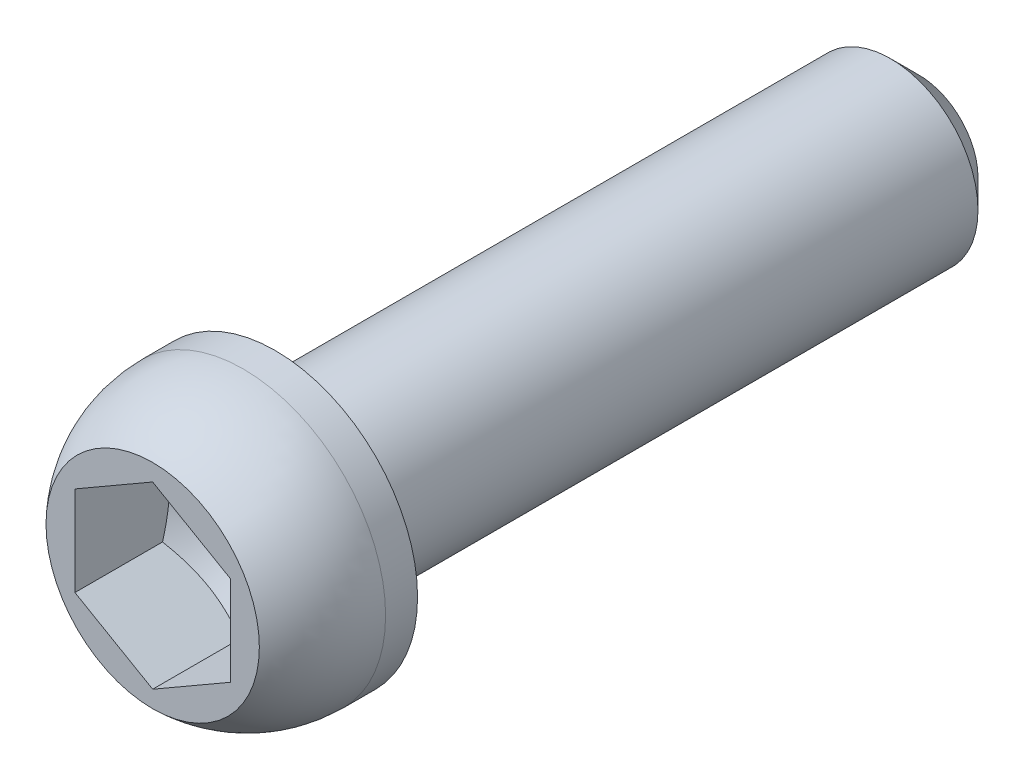
ISO-10303-21;
HEADER;
FILE_DESCRIPTION(('STEP AP214'),'2;1');
FILE_NAME('part.step','',(''),(''),'','','');
FILE_SCHEMA(('AUTOMOTIVE_DESIGN { 1 0 10303 214 1 1 1 1 }'));
ENDSEC;
DATA;
#1=APPLICATION_CONTEXT('core data for automotive mechanical design processes');
#2=APPLICATION_PROTOCOL_DEFINITION('international standard','automotive_design',2000,#1);
#3=PRODUCT_CONTEXT('',#1,'mechanical');
#4=PRODUCT('Part','Part','',(#3));
#5=PRODUCT_RELATED_PRODUCT_CATEGORY('part','',(#4));
#6=PRODUCT_DEFINITION_FORMATION('','',#4);
#7=PRODUCT_DEFINITION_CONTEXT('part definition',#1,'design');
#8=PRODUCT_DEFINITION('design','',#6,#7);
#9=PRODUCT_DEFINITION_SHAPE('','',#8);
#10=(LENGTH_UNIT() NAMED_UNIT(*) SI_UNIT(.MILLI.,.METRE.));
#11=(NAMED_UNIT(*) PLANE_ANGLE_UNIT() SI_UNIT($,.RADIAN.));
#12=(NAMED_UNIT(*) SI_UNIT($,.STERADIAN.) SOLID_ANGLE_UNIT());
#13=UNCERTAINTY_MEASURE_WITH_UNIT(LENGTH_MEASURE(1.E-05),#10,'distance_accuracy_value','');
#14=(GEOMETRIC_REPRESENTATION_CONTEXT(3) GLOBAL_UNCERTAINTY_ASSIGNED_CONTEXT((#13)) GLOBAL_UNIT_ASSIGNED_CONTEXT((#10,
#11,#12)) REPRESENTATION_CONTEXT('',''));
#15=CARTESIAN_POINT('',(0.,0.,0.));
#16=DIRECTION('',(0.,0.,1.));
#17=DIRECTION('',(1.,0.,0.));
#18=AXIS2_PLACEMENT_3D('',#15,#16,#17);
#19=CARTESIAN_POINT('',(0.,0.,-3.18333333333335));
#20=DIRECTION('',(0.,0.,1.));
#21=DIRECTION('',(1.,0.,0.));
#22=AXIS2_PLACEMENT_3D('',#19,#20,#21);
#23=CONICAL_SURFACE('',#22,0.,1.04719755119659);
#24=CARTESIAN_POINT('',(0.,0.,-3.18333333333335));
#25=VERTEX_POINT('',#24);
#26=VERTEX_LOOP('',#25);
#27=FACE_BOUND('',#26,.T.);
#28=CARTESIAN_POINT('',(1.775,-2.65388259149938,-1.33999236202937));
#29=CARTESIAN_POINT('',(1.775,-2.57723187339807,-1.37676648880287));
#30=CARTESIAN_POINT('',(1.775,-2.50039458134704,-1.41315855616911));
#31=CARTESIAN_POINT('',(1.775,-2.34624701162899,-1.4849620790204));
#32=CARTESIAN_POINT('',(1.775,-2.2689366518576,-1.52037335802871));
#33=CARTESIAN_POINT('',(1.775,-2.11329983278051,-1.59019663756769));
#34=CARTESIAN_POINT('',(1.775,-2.03497005455177,-1.62460127341837));
#35=CARTESIAN_POINT('',(1.775,-1.87765447943204,-1.69186699839932));
#36=CARTESIAN_POINT('',(1.775,-1.79866871690305,-1.72472816778732));
#37=CARTESIAN_POINT('',(1.775,-1.63782918302726,-1.78933644797688));
#38=CARTESIAN_POINT('',(1.775,-1.55595441399543,-1.82103198073615));
#39=CARTESIAN_POINT('',(1.775,-1.39123234048797,-1.88177722179619));
#40=CARTESIAN_POINT('',(1.775,-1.30838491561127,-1.91082659855747));
#41=CARTESIAN_POINT('',(1.775,-1.05851844665112,-1.99278038208063));
#42=CARTESIAN_POINT('',(1.775,-0.889717952953571,-2.04068269455351));
#43=CARTESIAN_POINT('',(1.775,-0.633139778883583,-2.09624702229421));
#44=CARTESIAN_POINT('',(1.775,-0.547132674269155,-2.11204643392357));
#45=CARTESIAN_POINT('',(1.775,-0.374150960599354,-2.13713244979764));
#46=CARTESIAN_POINT('',(1.775,-0.287176417328946,-2.14641949416034));
#47=CARTESIAN_POINT('',(1.775,-0.113788074254875,-2.15762173093196));
#48=CARTESIAN_POINT('',(1.775,-0.0273800417458598,-2.15962391641767));
#49=CARTESIAN_POINT('',(1.775,0.145293310861215,-2.15631901318237));
#50=CARTESIAN_POINT('',(1.775,0.231558621791361,-2.15101147186985));
#51=CARTESIAN_POINT('',(1.775,0.44440547183115,-2.12936480003112));
#52=CARTESIAN_POINT('',(1.775,0.570574541219666,-2.10896902686087));
#53=CARTESIAN_POINT('',(1.775,0.82045917206924,-2.05637421276262));
#54=CARTESIAN_POINT('',(1.775,0.944171586239336,-2.024160946065));
#55=CARTESIAN_POINT('',(1.775,1.12919710426535,-1.96913281473636));
#56=CARTESIAN_POINT('',(1.775,1.19146662732273,-1.94941541683593));
#57=CARTESIAN_POINT('',(1.775,1.31535748816402,-1.9081566488224));
#58=CARTESIAN_POINT('',(1.775,1.37697920384234,-1.88661641700883));
#59=CARTESIAN_POINT('',(1.775,1.49965679859283,-1.84202480868852));
#60=CARTESIAN_POINT('',(1.775,1.56071277820737,-1.81897370680913));
#61=CARTESIAN_POINT('',(1.775,1.68234363712417,-1.77160969301198));
#62=CARTESIAN_POINT('',(1.775,1.74291843313647,-1.74729656790644));
#63=CARTESIAN_POINT('',(1.775,1.89753807445394,-1.68367887381013));
#64=CARTESIAN_POINT('',(1.775,1.99127375112719,-1.64362368908069));
#65=CARTESIAN_POINT('',(1.775,2.17789863824487,-1.56158242825227));
#66=CARTESIAN_POINT('',(1.775,2.2707877846506,-1.51959620750253));
#67=CARTESIAN_POINT('',(1.775,2.54846748992191,-1.39142170306099));
#68=CARTESIAN_POINT('',(1.775,2.73223929797471,-1.30303071757429));
#69=CARTESIAN_POINT('',(1.775,3.09821289129684,-1.12254164384944));
#70=CARTESIAN_POINT('',(1.775,3.28041246874527,-1.03043913190653));
#71=CARTESIAN_POINT('',(1.775,3.64356329519938,-0.843865855290622));
#72=CARTESIAN_POINT('',(1.775,3.82451469918764,-0.749395391644858));
#73=CARTESIAN_POINT('',(1.775,4.16851495546281,-0.567816839144511));
#74=CARTESIAN_POINT('',(1.775,4.33164151455477,-0.480855454900836));
#75=CARTESIAN_POINT('',(1.775,4.65736990281899,-0.305941850642));
#76=CARTESIAN_POINT('',(1.775,4.81997171228405,-0.217989593958666));
#77=CARTESIAN_POINT('',(1.775,5.14435798457942,-0.0415673817268955));
#78=CARTESIAN_POINT('',(1.775,5.30614347439577,0.0469006880320478));
#79=CARTESIAN_POINT('',(1.775,5.62938736266175,0.224412626209064));
#80=CARTESIAN_POINT('',(1.775,5.79084577778576,0.313456464251978));
#81=CARTESIAN_POINT('',(1.775,5.9521866823928,0.402711437815645));
#82=B_SPLINE_CURVE_WITH_KNOTS('',3,(#28,#29,#30,#31,#32,#33,#34,#35,#36,#37,#38,#39,#40,#41,#42,
#43,#44,#45,#46,#47,#48,#49,#50,#51,#52,#53,#54,#55,#56,#57,#58,#59,#60,#61,#62,#63,#64,#65,#66,
#67,#68,#69,#70,#71,#72,#73,#74,#75,#76,#77,#78,#79,#80,#81),.UNSPECIFIED.,.F.,.F.,(4,2,2,2,2,2,
2,2,2,2,2,2,2,2,2,2,2,2,2,2,2,2,2,2,2,2,4),(0.,0.255050355099275,0.510146308038466,
0.766789682079517,1.02341969627536,1.28675824802195,1.55012974846392,2.07538700855926,
2.33752667378969,2.59964862142218,2.85862993855996,3.11762729159286,3.50026163136395,
3.88335810177898,4.0792865786266,4.27509359493504,4.47086511803289,4.66666982022703,
4.97244403467842,5.27824119160158,5.88993650764241,6.50238380490785,7.11475363542393,
7.66932438016952,8.22391571518533,8.77709643289933,9.33024820138869),.UNSPECIFIED.);
#83=CARTESIAN_POINT('',(1.775,1.02479672781159,-2.));
#84=VERTEX_POINT('',#83);
#85=CARTESIAN_POINT('',(1.775,-1.02479672781159,-2.));
#86=VERTEX_POINT('',#85);
#87=EDGE_CURVE('E72',#84,#86,#82,.F.);
#88=ORIENTED_EDGE('',*,*,#87,.F.);
#89=CARTESIAN_POINT('',(-0.000200000000000006,2.04970892567701,-1.99993332769985));
#90=CARTESIAN_POINT('',(0.0778038755846786,2.00467336711036,-2.02594650703797));
#91=CARTESIAN_POINT('',(0.156481072053006,1.95924906655029,-2.04960496849523));
#92=CARTESIAN_POINT('',(0.315197983124454,1.86761381521824,-2.09090202184949));
#93=CARTESIAN_POINT('',(0.395240518940076,1.82140123561847,-2.10852600268873));
#94=CARTESIAN_POINT('',(0.554333562173165,1.72954882428165,-2.13596162564219));
#95=CARTESIAN_POINT('',(0.633359584199548,1.68392312919173,-2.14595584379431));
#96=CARTESIAN_POINT('',(0.791783674507002,1.5924569380066,-2.15788916313207));
#97=CARTESIAN_POINT('',(0.871181166549998,1.5466167746026,-2.15983814370038));
#98=CARTESIAN_POINT('',(1.01955322372563,1.46095412745203,-2.15579426288569));
#99=CARTESIAN_POINT('',(1.08854994405223,1.42111885239827,-2.1507943146335));
#100=CARTESIAN_POINT('',(1.22609384875639,1.34170784199193,-2.13494409598986));
#101=CARTESIAN_POINT('',(1.29464055701815,1.30213238152494,-2.12408840558333));
#102=CARTESIAN_POINT('',(1.43246829564775,1.22255749952534,-2.096948714276));
#103=CARTESIAN_POINT('',(1.50173187223519,1.18256815493754,-2.08054961249006));
#104=CARTESIAN_POINT('',(1.63922568164091,1.10318606706524,-2.04332959946596));
#105=CARTESIAN_POINT('',(1.70745767741681,1.06379230593669,-2.02251743969294));
#106=CARTESIAN_POINT('',(1.7752,1.02468125775775,-1.99993332769985));
#107=B_SPLINE_CURVE_WITH_KNOTS('',3,(#89,#90,#91,#92,#93,#94,#95,#96,#97,#98,#99,#100,#101,#102,
#103,#104,#105,#106),.UNSPECIFIED.,.F.,.F.,(4,2,2,2,2,2,2,2,4),(0.,0.281367523536545,
0.56341157221704,0.838474362384902,1.11319928056261,1.35245334779782,1.59192924709632,
1.83671872808288,2.08102723653711),.UNSPECIFIED.);
#108=CARTESIAN_POINT('',(0.,2.04959345562317,-2.));
#109=VERTEX_POINT('',#108);
#110=EDGE_CURVE('E127',#109,#84,#107,.T.);
#111=ORIENTED_EDGE('',*,*,#110,.F.);
#112=CARTESIAN_POINT('',(-1.7752,1.02468125775775,-1.99993332769985));
#113=CARTESIAN_POINT('',(-1.69719612441532,1.0697168163244,-2.02594650703797));
#114=CARTESIAN_POINT('',(-1.61851892794699,1.11514111688447,-2.04960496849523));
#115=CARTESIAN_POINT('',(-1.45980201687555,1.20677636821652,-2.09090202184949));
#116=CARTESIAN_POINT('',(-1.37975948105992,1.25298894781629,-2.10852600268873));
#117=CARTESIAN_POINT('',(-1.22066643782683,1.34484135915311,-2.13596162564219));
#118=CARTESIAN_POINT('',(-1.14164041580045,1.39046705424302,-2.14595584379431));
#119=CARTESIAN_POINT('',(-0.983216325492998,1.48193324542816,-2.15788916313207));
#120=CARTESIAN_POINT('',(-0.903818833450002,1.52777340883216,-2.15983814370038));
#121=CARTESIAN_POINT('',(-0.755446776274367,1.61343605598273,-2.15579426288569));
#122=CARTESIAN_POINT('',(-0.686450055947772,1.65327133103649,-2.1507943146335));
#123=CARTESIAN_POINT('',(-0.548906151243613,1.73268234144283,-2.13494409598986));
#124=CARTESIAN_POINT('',(-0.480359442981854,1.77225780190982,-2.12408840558333));
#125=CARTESIAN_POINT('',(-0.342531704352253,1.85183268390942,-2.096948714276));
#126=CARTESIAN_POINT('',(-0.273268127764811,1.89182202849721,-2.08054961249006));
#127=CARTESIAN_POINT('',(-0.135774318359089,1.97120411636951,-2.04332959946596));
#128=CARTESIAN_POINT('',(-0.0675423225831936,2.01059787749807,-2.02251743969294));
#129=CARTESIAN_POINT('',(0.000199999999999925,2.04970892567701,-1.99993332769985));
#130=B_SPLINE_CURVE_WITH_KNOTS('',3,(#112,#113,#114,#115,#116,#117,#118,#119,#120,#121,#122,
#123,#124,#125,#126,#127,#128,#129),.UNSPECIFIED.,.F.,.F.,(4,2,2,2,2,2,2,2,4),(0.,
0.281367523536545,0.56341157221704,0.838474362384903,1.11319928056261,1.35245334779782,
1.59192924709632,1.83671872808288,2.08102723653711),.UNSPECIFIED.);
#131=CARTESIAN_POINT('',(-1.775,1.02479672781159,-2.));
#132=VERTEX_POINT('',#131);
#133=EDGE_CURVE('E214',#132,#109,#130,.T.);
#134=ORIENTED_EDGE('',*,*,#133,.F.);
#135=CARTESIAN_POINT('',(-1.775,-2.65388259054485,-1.33999236248745));
#136=CARTESIAN_POINT('',(-1.775,-2.57723187247616,-1.37676648924122));
#137=CARTESIAN_POINT('',(-1.775,-2.50039458045778,-1.41315855658774));
#138=CARTESIAN_POINT('',(-1.775,-2.34624701080513,-1.48496207939969));
#139=CARTESIAN_POINT('',(-1.775,-2.26893665106651,-1.5203733583884));
#140=CARTESIAN_POINT('',(-1.775,-2.11329983205557,-1.59019663788812));
#141=CARTESIAN_POINT('',(-1.775,-2.03497005386023,-1.62460127371917));
#142=CARTESIAN_POINT('',(-1.775,-1.87765447880754,-1.69186699866124));
#143=CARTESIAN_POINT('',(-1.775,-1.7986687163122,-1.72472816802999));
#144=CARTESIAN_POINT('',(-1.775,-1.63782918250568,-1.78933644818092));
#145=CARTESIAN_POINT('',(-1.775,-1.55595441350948,-1.82103198092085));
#146=CARTESIAN_POINT('',(-1.775,-1.39123234007391,-1.8817772219434));
#147=CARTESIAN_POINT('',(-1.775,-1.30838491523345,-1.91082659868654));
#148=CARTESIAN_POINT('',(-1.775,-1.05851844638299,-1.99278038215823));
#149=CARTESIAN_POINT('',(-1.775,-0.889717952760265,-2.0406826946005));
#150=CARTESIAN_POINT('',(-1.775,-0.633139778816619,-2.09624702230617));
#151=CARTESIAN_POINT('',(-1.775,-0.547132674252119,-2.11204643392519));
#152=CARTESIAN_POINT('',(-1.775,-0.374150960683227,-2.13713244978633));
#153=CARTESIAN_POINT('',(-1.775,-0.287176417463798,-2.14641949414645));
#154=CARTESIAN_POINT('',(-1.775,-0.113788074490735,-2.15762173092183));
#155=CARTESIAN_POINT('',(-1.775,-0.0273800420317455,-2.15962391641375));
#156=CARTESIAN_POINT('',(-1.775,0.145293310476219,-2.15631901319915));
#157=CARTESIAN_POINT('',(-1.775,0.23155862135728,-2.15101147190113));
#158=CARTESIAN_POINT('',(-1.775,0.444405471317282,-2.12936480010233));
#159=CARTESIAN_POINT('',(-1.775,0.570574540675661,-2.10896902695666));
#160=CARTESIAN_POINT('',(-1.775,0.82045917146688,-2.0563742129083));
#161=CARTESIAN_POINT('',(-1.775,0.944171585608761,-2.024160946236));
#162=CARTESIAN_POINT('',(-1.775,1.12919710359248,-1.9691328149449));
#163=CARTESIAN_POINT('',(-1.775,1.1914666266355,-1.9494154170571));
#164=CARTESIAN_POINT('',(-1.775,1.31535748744819,-1.9081566490685));
#165=CARTESIAN_POINT('',(-1.775,1.37697920311227,-1.88661641726724));
#166=CARTESIAN_POINT('',(-1.775,1.49965679783438,-1.84202480897118));
#167=CARTESIAN_POINT('',(-1.775,1.56071277743476,-1.81897370710372));
#168=CARTESIAN_POINT('',(-1.775,1.68234363632323,-1.77160969333013));
#169=CARTESIAN_POINT('',(-1.775,1.74291843232137,-1.74729656823621));
#170=CARTESIAN_POINT('',(-1.775,1.89753807362944,-1.68367887415816));
#171=CARTESIAN_POINT('',(-1.775,1.99127375030714,-1.64362368943443));
#172=CARTESIAN_POINT('',(-1.775,2.17789863743316,-1.56158242861583));
#173=CARTESIAN_POINT('',(-1.775,2.27078778384277,-1.51959620787021));
#174=CARTESIAN_POINT('',(-1.775,2.54846748912518,-1.3914217034393));
#175=CARTESIAN_POINT('',(-1.775,2.73223929718452,-1.3030307179574));
#176=CARTESIAN_POINT('',(-1.775,3.09821289051892,-1.12254164423961));
#177=CARTESIAN_POINT('',(-1.775,3.28041246797308,-1.03043913229894));
#178=CARTESIAN_POINT('',(-1.775,3.64356329443794,-0.84386585568612));
#179=CARTESIAN_POINT('',(-1.775,3.82451469843121,-0.749395392041196));
#180=CARTESIAN_POINT('',(-1.775,4.16851495471093,-0.567816839544035));
#181=CARTESIAN_POINT('',(-1.775,4.3316415138025,-0.480855455302821));
#182=CARTESIAN_POINT('',(-1.775,4.65736990206573,-0.30594185104847));
#183=CARTESIAN_POINT('',(-1.775,4.81997171153019,-0.21798959436716));
#184=CARTESIAN_POINT('',(-1.775,5.14435798382365,-0.0415673821394394));
#185=CARTESIAN_POINT('',(-1.775,5.30614347363868,0.0469006876174743));
#186=CARTESIAN_POINT('',(-1.775,5.62938736190191,0.224412625790636));
#187=CARTESIAN_POINT('',(-1.775,5.79084577702448,0.313456463831725));
#188=CARTESIAN_POINT('',(-1.775,5.95218668163005,0.402711437393635));
#189=B_SPLINE_CURVE_WITH_KNOTS('',3,(#135,#136,#137,#138,#139,#140,#141,#142,#143,#144,#145,
#146,#147,#148,#149,#150,#151,#152,#153,#154,#155,#156,#157,#158,#159,#160,#161,#162,#163,#164,
#165,#166,#167,#168,#169,#170,#171,#172,#173,#174,#175,#176,#177,#178,#179,#180,#181,#182,#183,
#184,#185,#186,#187,#188),.UNSPECIFIED.,.F.,.F.,(4,2,2,2,2,2,2,2,2,2,2,2,2,2,2,2,2,2,2,2,2,2,2,
2,2,2,4),(0.,0.255050354985432,0.510146307810761,0.766789681736408,1.02341969581686,
1.28675824744283,1.55012974776416,2.07538700761961,2.33752667269746,2.59964862017758,
2.85862993716631,3.11762729005003,3.50026162972022,3.88335810003405,4.07928657682912,
4.27509359308507,4.47086511613052,4.66666981827224,4.97244403272911,5.27824118965781,
5.88993650570995,6.50238380298768,7.11475363351589,7.66932437825697,8.2239157132683,
8.77709643097593,9.33024819945887),.UNSPECIFIED.);
#190=CARTESIAN_POINT('',(-1.775,-1.02479672781159,-2.));
#191=VERTEX_POINT('',#190);
#192=EDGE_CURVE('E199',#191,#132,#189,.T.);
#193=ORIENTED_EDGE('',*,*,#192,.F.);
#194=CARTESIAN_POINT('',(0.000200000000001198,-2.04970892567701,-1.99993332769985));
#195=CARTESIAN_POINT('',(-0.0778038755846772,-2.00467336711036,-2.02594650703797));
#196=CARTESIAN_POINT('',(-0.156481072053004,-1.95924906655029,-2.04960496849523));
#197=CARTESIAN_POINT('',(-0.315197983124452,-1.86761381521824,-2.09090202184949));
#198=CARTESIAN_POINT('',(-0.395240518940075,-1.82140123561847,-2.10852600268873));
#199=CARTESIAN_POINT('',(-0.554333562173164,-1.72954882428165,-2.13596162564219));
#200=CARTESIAN_POINT('',(-0.633359584199546,-1.68392312919173,-2.14595584379431));
#201=CARTESIAN_POINT('',(-0.791783674507001,-1.5924569380066,-2.15788916313207));
#202=CARTESIAN_POINT('',(-0.871181166549996,-1.5466167746026,-2.15983814370038));
#203=CARTESIAN_POINT('',(-1.01955322372563,-1.46095412745203,-2.15579426288569));
#204=CARTESIAN_POINT('',(-1.08854994405223,-1.42111885239827,-2.1507943146335));
#205=CARTESIAN_POINT('',(-1.22609384875639,-1.34170784199193,-2.13494409598986));
#206=CARTESIAN_POINT('',(-1.29464055701815,-1.30213238152494,-2.12408840558334));
#207=CARTESIAN_POINT('',(-1.43246829564775,-1.22255749952534,-2.096948714276));
#208=CARTESIAN_POINT('',(-1.50173187223519,-1.18256815493754,-2.08054961249006));
#209=CARTESIAN_POINT('',(-1.63922568164091,-1.10318606706524,-2.04332959946596));
#210=CARTESIAN_POINT('',(-1.70745767741681,-1.06379230593669,-2.02251743969294));
#211=CARTESIAN_POINT('',(-1.7752,-1.02468125775775,-1.99993332769985));
#212=B_SPLINE_CURVE_WITH_KNOTS('',3,(#194,#195,#196,#197,#198,#199,#200,#201,#202,#203,#204,
#205,#206,#207,#208,#209,#210,#211),.UNSPECIFIED.,.F.,.F.,(4,2,2,2,2,2,2,2,4),(0.,
0.281367523536545,0.56341157221704,0.838474362384902,1.11319928056261,1.35245334779782,
1.59192924709632,1.83671872808288,2.08102723653711),.UNSPECIFIED.);
#213=CARTESIAN_POINT('',(0.,-2.04959345562317,-2.));
#214=VERTEX_POINT('',#213);
#215=EDGE_CURVE('E174',#214,#191,#212,.T.);
#216=ORIENTED_EDGE('',*,*,#215,.F.);
#217=CARTESIAN_POINT('',(1.7752,-1.02468125775775,-1.99993332769985));
#218=CARTESIAN_POINT('',(1.69719612441532,-1.0697168163244,-2.02594650703797));
#219=CARTESIAN_POINT('',(1.618518927947,-1.11514111688447,-2.04960496849523));
#220=CARTESIAN_POINT('',(1.45980201687555,-1.20677636821652,-2.09090202184949));
#221=CARTESIAN_POINT('',(1.37975948105992,-1.25298894781629,-2.10852600268873));
#222=CARTESIAN_POINT('',(1.22066643782684,-1.34484135915311,-2.13596162564219));
#223=CARTESIAN_POINT('',(1.14164041580045,-1.39046705424302,-2.14595584379431));
#224=CARTESIAN_POINT('',(0.983216325492998,-1.48193324542816,-2.15788916313207));
#225=CARTESIAN_POINT('',(0.903818833450003,-1.52777340883216,-2.15983814370038));
#226=CARTESIAN_POINT('',(0.755446776274368,-1.61343605598273,-2.15579426288569));
#227=CARTESIAN_POINT('',(0.686450055947772,-1.65327133103649,-2.1507943146335));
#228=CARTESIAN_POINT('',(0.548906151243614,-1.73268234144283,-2.13494409598986));
#229=CARTESIAN_POINT('',(0.480359442981855,-1.77225780190982,-2.12408840558333));
#230=CARTESIAN_POINT('',(0.342531704352254,-1.85183268390942,-2.096948714276));
#231=CARTESIAN_POINT('',(0.273268127764812,-1.89182202849721,-2.08054961249006));
#232=CARTESIAN_POINT('',(0.13577431835909,-1.97120411636951,-2.04332959946596));
#233=CARTESIAN_POINT('',(0.0675423225831948,-2.01059787749807,-2.02251743969294));
#234=CARTESIAN_POINT('',(-0.000199999999998804,-2.04970892567701,-1.99993332769985));
#235=B_SPLINE_CURVE_WITH_KNOTS('',3,(#217,#218,#219,#220,#221,#222,#223,#224,#225,#226,#227,
#228,#229,#230,#231,#232,#233,#234),.UNSPECIFIED.,.F.,.F.,(4,2,2,2,2,2,2,2,4),(0.,
0.281367523536545,0.56341157221704,0.838474362384903,1.11319928056261,1.35245334779782,
1.59192924709632,1.83671872808288,2.08102723653711),.UNSPECIFIED.);
#236=EDGE_CURVE('E77',#86,#214,#235,.T.);
#237=ORIENTED_EDGE('',*,*,#236,.F.);
#238=EDGE_LOOP('',(#88,#111,#134,#193,#216,#237));
#239=FACE_BOUND('',#238,.T.);
#240=ADVANCED_FACE('F57',(#27,#239),#23,.F.);
#241=CARTESIAN_POINT('',(0.,0.,-17.5));
#242=DIRECTION('',(0.,0.,1.));
#243=DIRECTION('',(1.,0.,0.));
#244=AXIS2_PLACEMENT_3D('',#241,#242,#243);
#245=PLANE('',#244);
#246=CARTESIAN_POINT('',(0.,0.,-17.5));
#247=DIRECTION('',(0.,0.,1.));
#248=DIRECTION('',(1.,0.,0.));
#249=AXIS2_PLACEMENT_3D('',#246,#247,#248);
#250=CIRCLE('',#249,1.34999999999999);
#251=CARTESIAN_POINT('',(1.34999999999999,0.,-17.5));
#252=VERTEX_POINT('',#251);
#253=EDGE_CURVE('E12',#252,#252,#250,.F.);
#254=ORIENTED_EDGE('',*,*,#253,.T.);
#255=EDGE_LOOP('',(#254));
#256=FACE_BOUND('',#255,.T.);
#257=ADVANCED_FACE('F229',(#256),#245,.F.);
#258=CARTESIAN_POINT('',(0.,0.,-17.5));
#259=DIRECTION('',(0.,0.,1.));
#260=DIRECTION('',(1.,0.,0.));
#261=AXIS2_PLACEMENT_3D('',#258,#259,#260);
#262=CYLINDRICAL_SURFACE('',#261,2.);
#263=CARTESIAN_POINT('',(0.,0.,-16.85));
#264=DIRECTION('',(0.,0.,1.));
#265=DIRECTION('',(1.,0.,0.));
#266=AXIS2_PLACEMENT_3D('',#263,#264,#265);
#267=CIRCLE('',#266,2.);
#268=CARTESIAN_POINT('',(2.,0.,-16.85));
#269=VERTEX_POINT('',#268);
#270=EDGE_CURVE('E65',#269,#269,#267,.T.);
#271=ORIENTED_EDGE('',*,*,#270,.T.);
#272=EDGE_LOOP('',(#271));
#273=FACE_BOUND('',#272,.T.);
#274=CARTESIAN_POINT('',(0.,0.,-2.8));
#275=DIRECTION('',(0.,0.,1.));
#276=DIRECTION('',(1.,0.,0.));
#277=AXIS2_PLACEMENT_3D('',#274,#275,#276);
#278=CIRCLE('',#277,2.);
#279=CARTESIAN_POINT('',(2.,0.,-2.8));
#280=VERTEX_POINT('',#279);
#281=EDGE_CURVE('E258',#280,#280,#278,.T.);
#282=ORIENTED_EDGE('',*,*,#281,.F.);
#283=EDGE_LOOP('',(#282));
#284=FACE_BOUND('',#283,.T.);
#285=ADVANCED_FACE('F244',(#273,#284),#262,.T.);
#286=CARTESIAN_POINT('',(0.,3.25,-2.8));
#287=DIRECTION('',(0.,0.,1.));
#288=DIRECTION('',(1.,0.,0.));
#289=AXIS2_PLACEMENT_3D('',#286,#287,#288);
#290=PLANE('',#289);
#291=CARTESIAN_POINT('',(0.,0.,-2.8));
#292=DIRECTION('',(0.,0.,1.));
#293=DIRECTION('',(1.,0.,0.));
#294=AXIS2_PLACEMENT_3D('',#291,#292,#293);
#295=CIRCLE('',#294,3.25);
#296=CARTESIAN_POINT('',(3.25,0.,-2.8));
#297=VERTEX_POINT('',#296);
#298=EDGE_CURVE('E260',#297,#297,#295,.T.);
#299=ORIENTED_EDGE('',*,*,#298,.F.);
#300=EDGE_LOOP('',(#299));
#301=FACE_BOUND('',#300,.T.);
#302=ORIENTED_EDGE('',*,*,#281,.T.);
#303=EDGE_LOOP('',(#302));
#304=FACE_BOUND('',#303,.T.);
#305=ADVANCED_FACE('F240',(#301,#304),#290,.F.);
#306=CARTESIAN_POINT('',(0.,0.,-17.5));
#307=DIRECTION('',(0.,0.,1.));
#308=DIRECTION('',(1.,0.,0.));
#309=AXIS2_PLACEMENT_3D('',#306,#307,#308);
#310=CYLINDRICAL_SURFACE('',#309,3.25);
#311=CARTESIAN_POINT('',(0.,0.,-2.07));
#312=DIRECTION('',(0.,0.,1.));
#313=DIRECTION('',(1.,0.,0.));
#314=AXIS2_PLACEMENT_3D('',#311,#312,#313);
#315=CIRCLE('',#314,3.25);
#316=CARTESIAN_POINT('',(3.25,0.,-2.07));
#317=VERTEX_POINT('',#316);
#318=EDGE_CURVE('E264',#317,#317,#315,.T.);
#319=ORIENTED_EDGE('',*,*,#318,.F.);
#320=EDGE_LOOP('',(#319));
#321=FACE_BOUND('',#320,.T.);
#322=ORIENTED_EDGE('',*,*,#298,.T.);
#323=EDGE_LOOP('',(#322));
#324=FACE_BOUND('',#323,.T.);
#325=ADVANCED_FACE('F236',(#321,#324),#310,.T.);
#326=CARTESIAN_POINT('',(0.,0.,-2.07));
#327=DIRECTION('',(0.,0.,1.));
#328=DIRECTION('',(1.,0.,0.));
#329=AXIS2_PLACEMENT_3D('',#326,#327,#328);
#330=DEGENERATE_TOROIDAL_SURFACE('',#329,0.21,3.04,.T.);
#331=CARTESIAN_POINT('',(0.,0.,0.));
#332=DIRECTION('',(0.,0.,1.));
#333=DIRECTION('',(1.,0.,0.));
#334=AXIS2_PLACEMENT_3D('',#331,#332,#333);
#335=CIRCLE('',#334,2.43636474999044);
#336=CARTESIAN_POINT('',(2.43636474999044,0.,0.));
#337=VERTEX_POINT('',#336);
#338=EDGE_CURVE('E222',#337,#337,#335,.T.);
#339=ORIENTED_EDGE('',*,*,#338,.F.);
#340=EDGE_LOOP('',(#339));
#341=FACE_BOUND('',#340,.T.);
#342=ORIENTED_EDGE('',*,*,#318,.T.);
#343=EDGE_LOOP('',(#342));
#344=FACE_BOUND('',#343,.T.);
#345=ADVANCED_FACE('F233',(#341,#344),#330,.T.);
#346=CARTESIAN_POINT('',(0.,2.43636474999044,0.));
#347=DIRECTION('',(0.,0.,-1.));
#348=DIRECTION('',(-1.,0.,0.));
#349=AXIS2_PLACEMENT_3D('',#346,#347,#348);
#350=PLANE('',#349);
#351=DIRECTION('',(-0.866025403784439,-0.5,0.));
#352=VECTOR('',#351,1.);
#353=CARTESIAN_POINT('',(0.,2.04959345562317,0.));
#354=LINE('',#353,#352);
#355=CARTESIAN_POINT('',(0.,2.04959345562317,0.));
#356=VERTEX_POINT('',#355);
#357=CARTESIAN_POINT('',(-1.775,1.02479672781159,0.));
#358=VERTEX_POINT('',#357);
#359=EDGE_CURVE('E133',#356,#358,#354,.T.);
#360=ORIENTED_EDGE('',*,*,#359,.F.);
#361=DIRECTION('',(-0.866025403784439,0.5,0.));
#362=VECTOR('',#361,1.);
#363=CARTESIAN_POINT('',(1.775,1.02479672781159,0.));
#364=LINE('',#363,#362);
#365=CARTESIAN_POINT('',(1.775,1.02479672781159,0.));
#366=VERTEX_POINT('',#365);
#367=EDGE_CURVE('E126',#366,#356,#364,.T.);
#368=ORIENTED_EDGE('',*,*,#367,.F.);
#369=DIRECTION('',(0.,1.,0.));
#370=VECTOR('',#369,1.);
#371=CARTESIAN_POINT('',(1.775,-1.02479672781159,0.));
#372=LINE('',#371,#370);
#373=CARTESIAN_POINT('',(1.775,-1.02479672781159,0.));
#374=VERTEX_POINT('',#373);
#375=EDGE_CURVE('E112',#374,#366,#372,.T.);
#376=ORIENTED_EDGE('',*,*,#375,.F.);
#377=DIRECTION('',(0.866025403784439,0.5,0.));
#378=VECTOR('',#377,1.);
#379=CARTESIAN_POINT('',(0.,-2.04959345562317,0.));
#380=LINE('',#379,#378);
#381=CARTESIAN_POINT('',(0.,-2.04959345562317,0.));
#382=VERTEX_POINT('',#381);
#383=EDGE_CURVE('E172',#382,#374,#380,.T.);
#384=ORIENTED_EDGE('',*,*,#383,.F.);
#385=DIRECTION('',(0.866025403784439,-0.5,0.));
#386=VECTOR('',#385,1.);
#387=CARTESIAN_POINT('',(-1.775,-1.02479672781159,0.));
#388=LINE('',#387,#386);
#389=CARTESIAN_POINT('',(-1.775,-1.02479672781159,0.));
#390=VERTEX_POINT('',#389);
#391=EDGE_CURVE('E185',#390,#382,#388,.T.);
#392=ORIENTED_EDGE('',*,*,#391,.F.);
#393=DIRECTION('',(0.,-1.,0.));
#394=VECTOR('',#393,1.);
#395=CARTESIAN_POINT('',(-1.775,1.02479672781159,0.));
#396=LINE('',#395,#394);
#397=EDGE_CURVE('E207',#358,#390,#396,.T.);
#398=ORIENTED_EDGE('',*,*,#397,.F.);
#399=EDGE_LOOP('',(#360,#368,#376,#384,#392,#398));
#400=FACE_BOUND('',#399,.T.);
#401=ORIENTED_EDGE('',*,*,#338,.T.);
#402=EDGE_LOOP('',(#401));
#403=FACE_BOUND('',#402,.T.);
#404=ADVANCED_FACE('F130',(#400,#403),#350,.F.);
#405=CARTESIAN_POINT('',(0.,0.,-16.85));
#406=DIRECTION('',(0.,0.,1.));
#407=DIRECTION('',(1.,0.,0.));
#408=AXIS2_PLACEMENT_3D('',#405,#406,#407);
#409=CONICAL_SURFACE('',#408,2.,0.785398163397451);
#410=ORIENTED_EDGE('',*,*,#253,.F.);
#411=EDGE_LOOP('',(#410));
#412=FACE_BOUND('',#411,.T.);
#413=ORIENTED_EDGE('',*,*,#270,.F.);
#414=EDGE_LOOP('',(#413));
#415=FACE_BOUND('',#414,.T.);
#416=ADVANCED_FACE('F59',(#412,#415),#409,.T.);
#417=CARTESIAN_POINT('',(0.,2.04959345562317,-17.502));
#418=DIRECTION('',(-0.5,0.866025403784439,0.));
#419=DIRECTION('',(-0.866025403784439,-0.5,0.));
#420=AXIS2_PLACEMENT_3D('',#417,#418,#419);
#421=PLANE('',#420);
#422=DIRECTION('',(0.,0.,1.));
#423=VECTOR('',#422,1.);
#424=CARTESIAN_POINT('',(-1.775,1.02479672781159,-17.502));
#425=LINE('',#424,#423);
#426=EDGE_CURVE('E206',#132,#358,#425,.T.);
#427=ORIENTED_EDGE('',*,*,#426,.F.);
#428=ORIENTED_EDGE('',*,*,#133,.T.);
#429=DIRECTION('',(0.,0.,1.));
#430=VECTOR('',#429,1.);
#431=CARTESIAN_POINT('',(0.,2.04959345562317,-17.502));
#432=LINE('',#431,#430);
#433=EDGE_CURVE('E212',#109,#356,#432,.T.);
#434=ORIENTED_EDGE('',*,*,#433,.T.);
#435=ORIENTED_EDGE('',*,*,#359,.T.);
#436=EDGE_LOOP('',(#427,#428,#434,#435));
#437=FACE_BOUND('',#436,.T.);
#438=ADVANCED_FACE('F194',(#437),#421,.F.);
#439=CARTESIAN_POINT('',(-1.775,1.02479672781159,-17.502));
#440=DIRECTION('',(-1.,0.,0.));
#441=DIRECTION('',(0.,-1.,0.));
#442=AXIS2_PLACEMENT_3D('',#439,#440,#441);
#443=PLANE('',#442);
#444=DIRECTION('',(0.,0.,1.));
#445=VECTOR('',#444,1.);
#446=CARTESIAN_POINT('',(-1.775,-1.02479672781159,-17.502));
#447=LINE('',#446,#445);
#448=EDGE_CURVE('E184',#191,#390,#447,.T.);
#449=ORIENTED_EDGE('',*,*,#448,.F.);
#450=ORIENTED_EDGE('',*,*,#192,.T.);
#451=ORIENTED_EDGE('',*,*,#426,.T.);
#452=ORIENTED_EDGE('',*,*,#397,.T.);
#453=EDGE_LOOP('',(#449,#450,#451,#452));
#454=FACE_BOUND('',#453,.T.);
#455=ADVANCED_FACE('F190',(#454),#443,.F.);
#456=CARTESIAN_POINT('',(-1.775,-1.02479672781159,-17.502));
#457=DIRECTION('',(-0.5,-0.866025403784439,0.));
#458=DIRECTION('',(0.866025403784439,-0.5,0.));
#459=AXIS2_PLACEMENT_3D('',#456,#457,#458);
#460=PLANE('',#459);
#461=DIRECTION('',(0.,0.,1.));
#462=VECTOR('',#461,1.);
#463=CARTESIAN_POINT('',(0.,-2.04959345562317,-17.502));
#464=LINE('',#463,#462);
#465=EDGE_CURVE('E171',#214,#382,#464,.T.);
#466=ORIENTED_EDGE('',*,*,#465,.F.);
#467=ORIENTED_EDGE('',*,*,#215,.T.);
#468=ORIENTED_EDGE('',*,*,#448,.T.);
#469=ORIENTED_EDGE('',*,*,#391,.T.);
#470=EDGE_LOOP('',(#466,#467,#468,#469));
#471=FACE_BOUND('',#470,.T.);
#472=ADVANCED_FACE('F160',(#471),#460,.F.);
#473=CARTESIAN_POINT('',(0.,-2.04959345562317,-17.502));
#474=DIRECTION('',(0.5,-0.866025403784439,0.));
#475=DIRECTION('',(0.866025403784439,0.5,0.));
#476=AXIS2_PLACEMENT_3D('',#473,#474,#475);
#477=PLANE('',#476);
#478=DIRECTION('',(0.,0.,1.));
#479=VECTOR('',#478,1.);
#480=CARTESIAN_POINT('',(1.775,-1.02479672781159,-17.502));
#481=LINE('',#480,#479);
#482=EDGE_CURVE('E117',#86,#374,#481,.T.);
#483=ORIENTED_EDGE('',*,*,#482,.F.);
#484=ORIENTED_EDGE('',*,*,#236,.T.);
#485=ORIENTED_EDGE('',*,*,#465,.T.);
#486=ORIENTED_EDGE('',*,*,#383,.T.);
#487=EDGE_LOOP('',(#483,#484,#485,#486));
#488=FACE_BOUND('',#487,.T.);
#489=ADVANCED_FACE('F154',(#488),#477,.F.);
#490=CARTESIAN_POINT('',(1.775,-1.02479672781159,-17.502));
#491=DIRECTION('',(1.,0.,0.));
#492=DIRECTION('',(0.,1.,0.));
#493=AXIS2_PLACEMENT_3D('',#490,#491,#492);
#494=PLANE('',#493);
#495=DIRECTION('',(0.,0.,1.));
#496=VECTOR('',#495,1.);
#497=CARTESIAN_POINT('',(1.775,1.02479672781159,-17.502));
#498=LINE('',#497,#496);
#499=EDGE_CURVE('E115',#84,#366,#498,.T.);
#500=ORIENTED_EDGE('',*,*,#499,.F.);
#501=ORIENTED_EDGE('',*,*,#87,.T.);
#502=ORIENTED_EDGE('',*,*,#482,.T.);
#503=ORIENTED_EDGE('',*,*,#375,.T.);
#504=EDGE_LOOP('',(#500,#501,#502,#503));
#505=FACE_BOUND('',#504,.T.);
#506=ADVANCED_FACE('F114',(#505),#494,.F.);
#507=CARTESIAN_POINT('',(1.775,1.02479672781159,-17.502));
#508=DIRECTION('',(0.5,0.866025403784439,0.));
#509=DIRECTION('',(-0.866025403784439,0.5,0.));
#510=AXIS2_PLACEMENT_3D('',#507,#508,#509);
#511=PLANE('',#510);
#512=ORIENTED_EDGE('',*,*,#433,.F.);
#513=ORIENTED_EDGE('',*,*,#110,.T.);
#514=ORIENTED_EDGE('',*,*,#499,.T.);
#515=ORIENTED_EDGE('',*,*,#367,.T.);
#516=EDGE_LOOP('',(#512,#513,#514,#515));
#517=FACE_BOUND('',#516,.T.);
#518=ADVANCED_FACE('F125',(#517),#511,.F.);
#519=CLOSED_SHELL('',(#240,#257,#285,#305,#325,#345,#404,#416,#438,#455,#472,#489,#506,#518));
#520=MANIFOLD_SOLID_BREP('B2',#519);
#521=ADVANCED_BREP_SHAPE_REPRESENTATION('',(#18,#520),#14);
#522=SHAPE_DEFINITION_REPRESENTATION(#9,#521);
ENDSEC;
END-ISO-10303-21;
